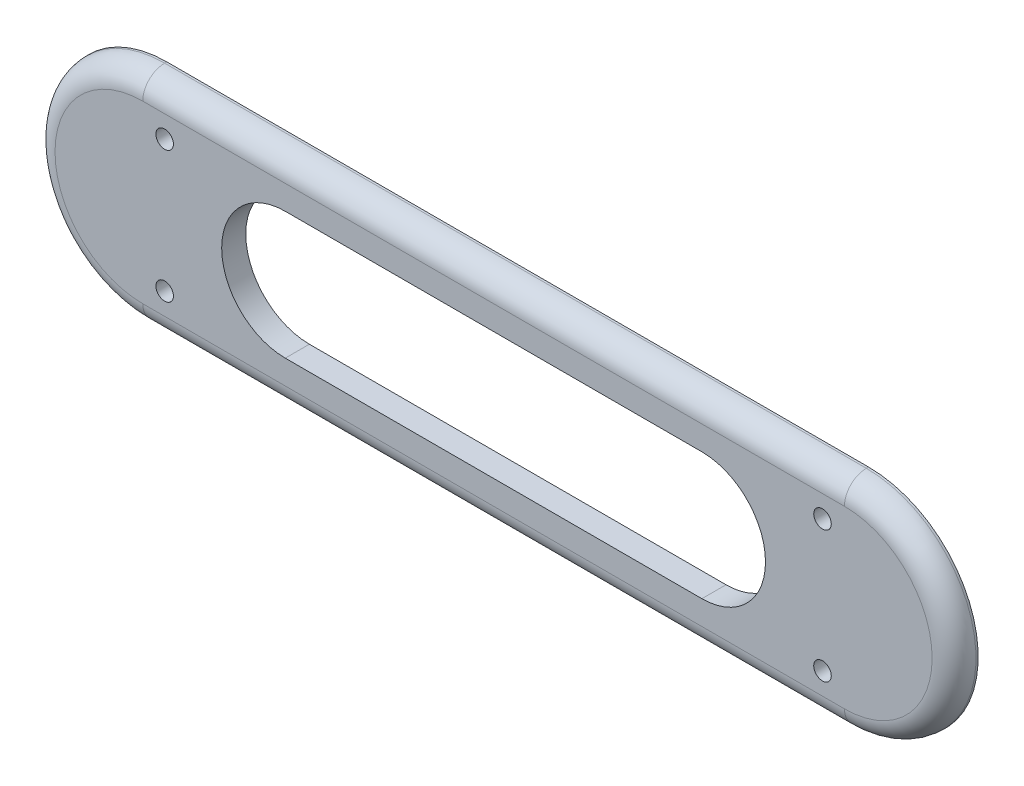
ISO-10303-21;
HEADER;
FILE_DESCRIPTION(('STEP AP214'),'2;1');
FILE_NAME('part.step','',(''),(''),'','','');
FILE_SCHEMA(('AUTOMOTIVE_DESIGN { 1 0 10303 214 1 1 1 1 }'));
ENDSEC;
DATA;
#1=APPLICATION_CONTEXT('core data for automotive mechanical design processes');
#2=APPLICATION_PROTOCOL_DEFINITION('international standard','automotive_design',2000,#1);
#3=PRODUCT_CONTEXT('',#1,'mechanical');
#4=PRODUCT('Part','Part','',(#3));
#5=PRODUCT_RELATED_PRODUCT_CATEGORY('part','',(#4));
#6=PRODUCT_DEFINITION_FORMATION('','',#4);
#7=PRODUCT_DEFINITION_CONTEXT('part definition',#1,'design');
#8=PRODUCT_DEFINITION('design','',#6,#7);
#9=PRODUCT_DEFINITION_SHAPE('','',#8);
#10=(LENGTH_UNIT() NAMED_UNIT(*) SI_UNIT(.MILLI.,.METRE.));
#11=(NAMED_UNIT(*) PLANE_ANGLE_UNIT() SI_UNIT($,.RADIAN.));
#12=(NAMED_UNIT(*) SI_UNIT($,.STERADIAN.) SOLID_ANGLE_UNIT());
#13=UNCERTAINTY_MEASURE_WITH_UNIT(LENGTH_MEASURE(1.E-05),#10,'distance_accuracy_value','');
#14=(GEOMETRIC_REPRESENTATION_CONTEXT(3) GLOBAL_UNCERTAINTY_ASSIGNED_CONTEXT((#13)) GLOBAL_UNIT_ASSIGNED_CONTEXT((#10,
#11,#12)) REPRESENTATION_CONTEXT('',''));
#15=CARTESIAN_POINT('',(0.,0.,0.));
#16=DIRECTION('',(0.,0.,1.));
#17=DIRECTION('',(1.,0.,0.));
#18=AXIS2_PLACEMENT_3D('',#15,#16,#17);
#19=CARTESIAN_POINT('',(-80.,0.,5.5));
#20=DIRECTION('',(0.,0.,-1.));
#21=DIRECTION('',(-1.,0.,0.));
#22=AXIS2_PLACEMENT_3D('',#19,#20,#21);
#23=PLANE('',#22);
#24=DIRECTION('',(1.,0.,0.));
#25=VECTOR('',#24,1.);
#26=CARTESIAN_POINT('',(-80.,-20.,5.5));
#27=LINE('',#26,#25);
#28=CARTESIAN_POINT('',(-80.,-20.,5.5));
#29=VERTEX_POINT('',#28);
#30=CARTESIAN_POINT('',(80.,-20.,5.5));
#31=VERTEX_POINT('',#30);
#32=EDGE_CURVE('E183',#29,#31,#27,.T.);
#33=ORIENTED_EDGE('',*,*,#32,.T.);
#34=CARTESIAN_POINT('',(80.,0.,5.5));
#35=DIRECTION('',(0.,0.,-1.));
#36=DIRECTION('',(-1.,0.,0.));
#37=AXIS2_PLACEMENT_3D('',#34,#35,#36);
#38=CIRCLE('',#37,20.);
#39=CARTESIAN_POINT('',(80.,20.,5.5));
#40=VERTEX_POINT('',#39);
#41=EDGE_CURVE('E190',#31,#40,#38,.F.);
#42=ORIENTED_EDGE('',*,*,#41,.T.);
#43=DIRECTION('',(-1.,0.,0.));
#44=VECTOR('',#43,1.);
#45=CARTESIAN_POINT('',(-80.,20.,5.5));
#46=LINE('',#45,#44);
#47=CARTESIAN_POINT('',(-80.,20.,5.5));
#48=VERTEX_POINT('',#47);
#49=EDGE_CURVE('E182',#40,#48,#46,.T.);
#50=ORIENTED_EDGE('',*,*,#49,.T.);
#51=CARTESIAN_POINT('',(-80.,0.,5.5));
#52=DIRECTION('',(0.,0.,-1.));
#53=DIRECTION('',(-1.,0.,0.));
#54=AXIS2_PLACEMENT_3D('',#51,#52,#53);
#55=CIRCLE('',#54,20.);
#56=EDGE_CURVE('E181',#48,#29,#55,.F.);
#57=ORIENTED_EDGE('',*,*,#56,.T.);
#58=EDGE_LOOP('',(#33,#42,#50,#57));
#59=FACE_BOUND('',#58,.T.);
#60=CARTESIAN_POINT('',(-47.5,0.,5.5));
#61=DIRECTION('',(0.,0.,1.));
#62=DIRECTION('',(1.,0.,0.));
#63=AXIS2_PLACEMENT_3D('',#60,#61,#62);
#64=CIRCLE('',#63,14.5);
#65=CARTESIAN_POINT('',(-47.5,14.5,5.5));
#66=VERTEX_POINT('',#65);
#67=CARTESIAN_POINT('',(-47.5,-14.5,5.5));
#68=VERTEX_POINT('',#67);
#69=EDGE_CURVE('E117',#66,#68,#64,.T.);
#70=ORIENTED_EDGE('',*,*,#69,.F.);
#71=DIRECTION('',(-1.,0.,0.));
#72=VECTOR('',#71,1.);
#73=CARTESIAN_POINT('',(-47.5,14.5,5.5));
#74=LINE('',#73,#72);
#75=CARTESIAN_POINT('',(47.5,14.5,5.5));
#76=VERTEX_POINT('',#75);
#77=EDGE_CURVE('E145',#76,#66,#74,.T.);
#78=ORIENTED_EDGE('',*,*,#77,.F.);
#79=CARTESIAN_POINT('',(47.5,0.,5.5));
#80=DIRECTION('',(0.,0.,1.));
#81=DIRECTION('',(-1.,0.,0.));
#82=AXIS2_PLACEMENT_3D('',#79,#80,#81);
#83=CIRCLE('',#82,14.5);
#84=CARTESIAN_POINT('',(47.5,-14.5,5.5));
#85=VERTEX_POINT('',#84);
#86=EDGE_CURVE('E142',#85,#76,#83,.T.);
#87=ORIENTED_EDGE('',*,*,#86,.F.);
#88=DIRECTION('',(1.,0.,0.));
#89=VECTOR('',#88,1.);
#90=CARTESIAN_POINT('',(-47.5,-14.5,5.5));
#91=LINE('',#90,#89);
#92=EDGE_CURVE('E126',#68,#85,#91,.T.);
#93=ORIENTED_EDGE('',*,*,#92,.F.);
#94=EDGE_LOOP('',(#70,#78,#87,#93));
#95=FACE_BOUND('',#94,.T.);
#96=CARTESIAN_POINT('',(-75.,15.,5.5));
#97=DIRECTION('',(0.,0.,1.));
#98=DIRECTION('',(1.,0.,0.));
#99=AXIS2_PLACEMENT_3D('',#96,#97,#98);
#100=CIRCLE('',#99,2.);
#101=CARTESIAN_POINT('',(-73.,15.,5.5));
#102=VERTEX_POINT('',#101);
#103=EDGE_CURVE('E151',#102,#102,#100,.T.);
#104=ORIENTED_EDGE('',*,*,#103,.F.);
#105=EDGE_LOOP('',(#104));
#106=FACE_BOUND('',#105,.T.);
#107=CARTESIAN_POINT('',(-75.,-15.,5.5));
#108=DIRECTION('',(0.,0.,1.));
#109=DIRECTION('',(-1.,0.,0.));
#110=AXIS2_PLACEMENT_3D('',#107,#108,#109);
#111=CIRCLE('',#110,2.);
#112=CARTESIAN_POINT('',(-77.,-15.,5.5));
#113=VERTEX_POINT('',#112);
#114=EDGE_CURVE('E221',#113,#113,#111,.T.);
#115=ORIENTED_EDGE('',*,*,#114,.F.);
#116=EDGE_LOOP('',(#115));
#117=FACE_BOUND('',#116,.T.);
#118=CARTESIAN_POINT('',(75.,-15.,5.5));
#119=DIRECTION('',(0.,0.,1.));
#120=DIRECTION('',(1.,0.,0.));
#121=AXIS2_PLACEMENT_3D('',#118,#119,#120);
#122=CIRCLE('',#121,2.);
#123=CARTESIAN_POINT('',(77.,-15.,5.5));
#124=VERTEX_POINT('',#123);
#125=EDGE_CURVE('E217',#124,#124,#122,.T.);
#126=ORIENTED_EDGE('',*,*,#125,.F.);
#127=EDGE_LOOP('',(#126));
#128=FACE_BOUND('',#127,.T.);
#129=CARTESIAN_POINT('',(75.,15.,5.5));
#130=DIRECTION('',(0.,0.,1.));
#131=DIRECTION('',(-1.,0.,0.));
#132=AXIS2_PLACEMENT_3D('',#129,#130,#131);
#133=CIRCLE('',#132,2.);
#134=CARTESIAN_POINT('',(73.,15.,5.5));
#135=VERTEX_POINT('',#134);
#136=EDGE_CURVE('E209',#135,#135,#133,.T.);
#137=ORIENTED_EDGE('',*,*,#136,.F.);
#138=EDGE_LOOP('',(#137));
#139=FACE_BOUND('',#138,.T.);
#140=ADVANCED_FACE('F39',(#59,#95,#106,#117,#128,#139),#23,.F.);
#141=CARTESIAN_POINT('',(-80.,0.,0.));
#142=DIRECTION('',(0.,0.,-1.));
#143=DIRECTION('',(-1.,0.,0.));
#144=AXIS2_PLACEMENT_3D('',#141,#142,#143);
#145=PLANE('',#144);
#146=CARTESIAN_POINT('',(75.,-15.,0.));
#147=DIRECTION('',(0.,0.,1.));
#148=DIRECTION('',(1.,0.,0.));
#149=AXIS2_PLACEMENT_3D('',#146,#147,#148);
#150=CIRCLE('',#149,2.);
#151=CARTESIAN_POINT('',(77.,-15.,0.));
#152=VERTEX_POINT('',#151);
#153=EDGE_CURVE('E214',#152,#152,#150,.T.);
#154=ORIENTED_EDGE('',*,*,#153,.T.);
#155=EDGE_LOOP('',(#154));
#156=FACE_BOUND('',#155,.T.);
#157=CARTESIAN_POINT('',(-75.,15.,0.));
#158=DIRECTION('',(0.,0.,1.));
#159=DIRECTION('',(1.,0.,0.));
#160=AXIS2_PLACEMENT_3D('',#157,#158,#159);
#161=CIRCLE('',#160,2.);
#162=CARTESIAN_POINT('',(-73.,15.,0.));
#163=VERTEX_POINT('',#162);
#164=EDGE_CURVE('E230',#163,#163,#161,.T.);
#165=ORIENTED_EDGE('',*,*,#164,.T.);
#166=EDGE_LOOP('',(#165));
#167=FACE_BOUND('',#166,.T.);
#168=CARTESIAN_POINT('',(-80.,0.,0.));
#169=DIRECTION('',(0.,0.,1.));
#170=DIRECTION('',(-1.,0.,0.));
#171=AXIS2_PLACEMENT_3D('',#168,#169,#170);
#172=CIRCLE('',#171,25.);
#173=CARTESIAN_POINT('',(-80.,25.,0.));
#174=VERTEX_POINT('',#173);
#175=CARTESIAN_POINT('',(-80.,-25.,0.));
#176=VERTEX_POINT('',#175);
#177=EDGE_CURVE('E136',#174,#176,#172,.T.);
#178=ORIENTED_EDGE('',*,*,#177,.F.);
#179=DIRECTION('',(-1.,0.,0.));
#180=VECTOR('',#179,1.);
#181=CARTESIAN_POINT('',(-80.,25.,0.));
#182=LINE('',#181,#180);
#183=CARTESIAN_POINT('',(80.,25.,0.));
#184=VERTEX_POINT('',#183);
#185=EDGE_CURVE('E168',#184,#174,#182,.T.);
#186=ORIENTED_EDGE('',*,*,#185,.F.);
#187=CARTESIAN_POINT('',(80.,0.,0.));
#188=DIRECTION('',(0.,0.,1.));
#189=DIRECTION('',(1.,0.,0.));
#190=AXIS2_PLACEMENT_3D('',#187,#188,#189);
#191=CIRCLE('',#190,25.);
#192=CARTESIAN_POINT('',(80.,-25.,0.));
#193=VERTEX_POINT('',#192);
#194=EDGE_CURVE('E170',#193,#184,#191,.T.);
#195=ORIENTED_EDGE('',*,*,#194,.F.);
#196=DIRECTION('',(1.,0.,0.));
#197=VECTOR('',#196,1.);
#198=CARTESIAN_POINT('',(-80.,-25.,0.));
#199=LINE('',#198,#197);
#200=EDGE_CURVE('E163',#176,#193,#199,.T.);
#201=ORIENTED_EDGE('',*,*,#200,.F.);
#202=EDGE_LOOP('',(#178,#186,#195,#201));
#203=FACE_BOUND('',#202,.T.);
#204=DIRECTION('',(-1.,0.,0.));
#205=VECTOR('',#204,1.);
#206=CARTESIAN_POINT('',(-47.5,14.5,0.));
#207=LINE('',#206,#205);
#208=CARTESIAN_POINT('',(47.5,14.5,0.));
#209=VERTEX_POINT('',#208);
#210=CARTESIAN_POINT('',(-47.5,14.5,0.));
#211=VERTEX_POINT('',#210);
#212=EDGE_CURVE('E129',#209,#211,#207,.T.);
#213=ORIENTED_EDGE('',*,*,#212,.T.);
#214=CARTESIAN_POINT('',(-47.5,0.,0.));
#215=DIRECTION('',(0.,0.,1.));
#216=DIRECTION('',(1.,0.,0.));
#217=AXIS2_PLACEMENT_3D('',#214,#215,#216);
#218=CIRCLE('',#217,14.5);
#219=CARTESIAN_POINT('',(-47.5,-14.5,0.));
#220=VERTEX_POINT('',#219);
#221=EDGE_CURVE('E149',#211,#220,#218,.T.);
#222=ORIENTED_EDGE('',*,*,#221,.T.);
#223=DIRECTION('',(1.,0.,0.));
#224=VECTOR('',#223,1.);
#225=CARTESIAN_POINT('',(-47.5,-14.5,0.));
#226=LINE('',#225,#224);
#227=CARTESIAN_POINT('',(47.5,-14.5,0.));
#228=VERTEX_POINT('',#227);
#229=EDGE_CURVE('E134',#220,#228,#226,.T.);
#230=ORIENTED_EDGE('',*,*,#229,.T.);
#231=CARTESIAN_POINT('',(47.5,0.,0.));
#232=DIRECTION('',(0.,0.,1.));
#233=DIRECTION('',(-1.,0.,0.));
#234=AXIS2_PLACEMENT_3D('',#231,#232,#233);
#235=CIRCLE('',#234,14.5);
#236=EDGE_CURVE('E153',#228,#209,#235,.T.);
#237=ORIENTED_EDGE('',*,*,#236,.T.);
#238=EDGE_LOOP('',(#213,#222,#230,#237));
#239=FACE_BOUND('',#238,.T.);
#240=CARTESIAN_POINT('',(-75.,-15.,0.));
#241=DIRECTION('',(0.,0.,1.));
#242=DIRECTION('',(-1.,0.,0.));
#243=AXIS2_PLACEMENT_3D('',#240,#241,#242);
#244=CIRCLE('',#243,2.);
#245=CARTESIAN_POINT('',(-77.,-15.,0.));
#246=VERTEX_POINT('',#245);
#247=EDGE_CURVE('E222',#246,#246,#244,.T.);
#248=ORIENTED_EDGE('',*,*,#247,.T.);
#249=EDGE_LOOP('',(#248));
#250=FACE_BOUND('',#249,.T.);
#251=CARTESIAN_POINT('',(75.,15.,0.));
#252=DIRECTION('',(0.,0.,1.));
#253=DIRECTION('',(-1.,0.,0.));
#254=AXIS2_PLACEMENT_3D('',#251,#252,#253);
#255=CIRCLE('',#254,2.);
#256=CARTESIAN_POINT('',(73.,15.,0.));
#257=VERTEX_POINT('',#256);
#258=EDGE_CURVE('E202',#257,#257,#255,.T.);
#259=ORIENTED_EDGE('',*,*,#258,.T.);
#260=EDGE_LOOP('',(#259));
#261=FACE_BOUND('',#260,.T.);
#262=ADVANCED_FACE('F232',(#156,#167,#203,#239,#250,#261),#145,.T.);
#263=CARTESIAN_POINT('',(-80.,0.,5.5));
#264=DIRECTION('',(0.,0.,-1.));
#265=DIRECTION('',(-1.,0.,0.));
#266=AXIS2_PLACEMENT_3D('',#263,#264,#265);
#267=CYLINDRICAL_SURFACE('',#266,25.);
#268=DIRECTION('',(0.,0.,-1.));
#269=VECTOR('',#268,1.);
#270=CARTESIAN_POINT('',(-80.,-25.,5.5));
#271=LINE('',#270,#269);
#272=CARTESIAN_POINT('',(-80.,-25.,0.5));
#273=VERTEX_POINT('',#272);
#274=EDGE_CURVE('E177',#273,#176,#271,.T.);
#275=ORIENTED_EDGE('',*,*,#274,.F.);
#276=CARTESIAN_POINT('',(-80.,0.,0.5));
#277=DIRECTION('',(0.,0.,-1.));
#278=DIRECTION('',(-1.,0.,0.));
#279=AXIS2_PLACEMENT_3D('',#276,#277,#278);
#280=CIRCLE('',#279,25.);
#281=CARTESIAN_POINT('',(-80.,25.,0.5));
#282=VERTEX_POINT('',#281);
#283=EDGE_CURVE('E48',#273,#282,#280,.T.);
#284=ORIENTED_EDGE('',*,*,#283,.T.);
#285=DIRECTION('',(0.,0.,-1.));
#286=VECTOR('',#285,1.);
#287=CARTESIAN_POINT('',(-80.,25.,5.5));
#288=LINE('',#287,#286);
#289=EDGE_CURVE('E172',#282,#174,#288,.T.);
#290=ORIENTED_EDGE('',*,*,#289,.T.);
#291=ORIENTED_EDGE('',*,*,#177,.T.);
#292=EDGE_LOOP('',(#275,#284,#290,#291));
#293=FACE_BOUND('',#292,.T.);
#294=ADVANCED_FACE('F261',(#293),#267,.T.);
#295=CARTESIAN_POINT('',(-80.,-25.,5.5));
#296=DIRECTION('',(0.,1.,0.));
#297=DIRECTION('',(-1.,0.,0.));
#298=AXIS2_PLACEMENT_3D('',#295,#296,#297);
#299=PLANE('',#298);
#300=DIRECTION('',(0.,0.,-1.));
#301=VECTOR('',#300,1.);
#302=CARTESIAN_POINT('',(80.,-25.,5.5));
#303=LINE('',#302,#301);
#304=CARTESIAN_POINT('',(80.,-25.,0.5));
#305=VERTEX_POINT('',#304);
#306=EDGE_CURVE('E180',#305,#193,#303,.T.);
#307=ORIENTED_EDGE('',*,*,#306,.F.);
#308=DIRECTION('',(1.,0.,0.));
#309=VECTOR('',#308,1.);
#310=CARTESIAN_POINT('',(-80.,-25.,0.5));
#311=LINE('',#310,#309);
#312=EDGE_CURVE('E62',#305,#273,#311,.F.);
#313=ORIENTED_EDGE('',*,*,#312,.T.);
#314=ORIENTED_EDGE('',*,*,#274,.T.);
#315=ORIENTED_EDGE('',*,*,#200,.T.);
#316=EDGE_LOOP('',(#307,#313,#314,#315));
#317=FACE_BOUND('',#316,.T.);
#318=ADVANCED_FACE('F273',(#317),#299,.F.);
#319=CARTESIAN_POINT('',(80.,0.,5.5));
#320=DIRECTION('',(0.,0.,-1.));
#321=DIRECTION('',(-1.,0.,0.));
#322=AXIS2_PLACEMENT_3D('',#319,#320,#321);
#323=CYLINDRICAL_SURFACE('',#322,25.);
#324=DIRECTION('',(0.,0.,-1.));
#325=VECTOR('',#324,1.);
#326=CARTESIAN_POINT('',(80.,25.,5.5));
#327=LINE('',#326,#325);
#328=CARTESIAN_POINT('',(80.,25.,0.5));
#329=VERTEX_POINT('',#328);
#330=EDGE_CURVE('E174',#329,#184,#327,.T.);
#331=ORIENTED_EDGE('',*,*,#330,.F.);
#332=CARTESIAN_POINT('',(80.,0.,0.5));
#333=DIRECTION('',(0.,0.,-1.));
#334=DIRECTION('',(-1.,0.,0.));
#335=AXIS2_PLACEMENT_3D('',#332,#333,#334);
#336=CIRCLE('',#335,25.);
#337=EDGE_CURVE('E189',#329,#305,#336,.T.);
#338=ORIENTED_EDGE('',*,*,#337,.T.);
#339=ORIENTED_EDGE('',*,*,#306,.T.);
#340=ORIENTED_EDGE('',*,*,#194,.T.);
#341=EDGE_LOOP('',(#331,#338,#339,#340));
#342=FACE_BOUND('',#341,.T.);
#343=ADVANCED_FACE('F269',(#342),#323,.T.);
#344=CARTESIAN_POINT('',(-80.,25.,5.5));
#345=DIRECTION('',(0.,-1.,0.));
#346=DIRECTION('',(1.,0.,0.));
#347=AXIS2_PLACEMENT_3D('',#344,#345,#346);
#348=PLANE('',#347);
#349=ORIENTED_EDGE('',*,*,#289,.F.);
#350=DIRECTION('',(-1.,0.,0.));
#351=VECTOR('',#350,1.);
#352=CARTESIAN_POINT('',(-80.,25.,0.5));
#353=LINE('',#352,#351);
#354=EDGE_CURVE('E11',#282,#329,#353,.F.);
#355=ORIENTED_EDGE('',*,*,#354,.T.);
#356=ORIENTED_EDGE('',*,*,#330,.T.);
#357=ORIENTED_EDGE('',*,*,#185,.T.);
#358=EDGE_LOOP('',(#349,#355,#356,#357));
#359=FACE_BOUND('',#358,.T.);
#360=ADVANCED_FACE('F270',(#359),#348,.F.);
#361=CARTESIAN_POINT('',(-47.5,0.,5.5));
#362=DIRECTION('',(0.,0.,-1.));
#363=DIRECTION('',(-1.,0.,0.));
#364=AXIS2_PLACEMENT_3D('',#361,#362,#363);
#365=CYLINDRICAL_SURFACE('',#364,14.5);
#366=ORIENTED_EDGE('',*,*,#221,.F.);
#367=DIRECTION('',(0.,0.,-1.));
#368=VECTOR('',#367,1.);
#369=CARTESIAN_POINT('',(-47.5,14.5,5.5));
#370=LINE('',#369,#368);
#371=EDGE_CURVE('E122',#66,#211,#370,.T.);
#372=ORIENTED_EDGE('',*,*,#371,.F.);
#373=ORIENTED_EDGE('',*,*,#69,.T.);
#374=DIRECTION('',(0.,0.,-1.));
#375=VECTOR('',#374,1.);
#376=CARTESIAN_POINT('',(-47.5,-14.5,5.5));
#377=LINE('',#376,#375);
#378=EDGE_CURVE('E121',#68,#220,#377,.T.);
#379=ORIENTED_EDGE('',*,*,#378,.T.);
#380=EDGE_LOOP('',(#366,#372,#373,#379));
#381=FACE_BOUND('',#380,.T.);
#382=ADVANCED_FACE('F119',(#381),#365,.F.);
#383=CARTESIAN_POINT('',(-47.5,-14.5,5.5));
#384=DIRECTION('',(0.,1.,0.));
#385=DIRECTION('',(-1.,0.,0.));
#386=AXIS2_PLACEMENT_3D('',#383,#384,#385);
#387=PLANE('',#386);
#388=ORIENTED_EDGE('',*,*,#229,.F.);
#389=ORIENTED_EDGE('',*,*,#378,.F.);
#390=ORIENTED_EDGE('',*,*,#92,.T.);
#391=DIRECTION('',(0.,0.,-1.));
#392=VECTOR('',#391,1.);
#393=CARTESIAN_POINT('',(47.5,-14.5,5.5));
#394=LINE('',#393,#392);
#395=EDGE_CURVE('E140',#85,#228,#394,.T.);
#396=ORIENTED_EDGE('',*,*,#395,.T.);
#397=EDGE_LOOP('',(#388,#389,#390,#396));
#398=FACE_BOUND('',#397,.T.);
#399=ADVANCED_FACE('F135',(#398),#387,.T.);
#400=CARTESIAN_POINT('',(47.5,0.,5.5));
#401=DIRECTION('',(0.,0.,-1.));
#402=DIRECTION('',(-1.,0.,0.));
#403=AXIS2_PLACEMENT_3D('',#400,#401,#402);
#404=CYLINDRICAL_SURFACE('',#403,14.5);
#405=ORIENTED_EDGE('',*,*,#236,.F.);
#406=ORIENTED_EDGE('',*,*,#395,.F.);
#407=ORIENTED_EDGE('',*,*,#86,.T.);
#408=DIRECTION('',(0.,0.,-1.));
#409=VECTOR('',#408,1.);
#410=CARTESIAN_POINT('',(47.5,14.5,5.5));
#411=LINE('',#410,#409);
#412=EDGE_CURVE('E157',#76,#209,#411,.T.);
#413=ORIENTED_EDGE('',*,*,#412,.T.);
#414=EDGE_LOOP('',(#405,#406,#407,#413));
#415=FACE_BOUND('',#414,.T.);
#416=ADVANCED_FACE('F249',(#415),#404,.F.);
#417=CARTESIAN_POINT('',(-47.5,14.5,5.5));
#418=DIRECTION('',(0.,-1.,0.));
#419=DIRECTION('',(1.,0.,0.));
#420=AXIS2_PLACEMENT_3D('',#417,#418,#419);
#421=PLANE('',#420);
#422=ORIENTED_EDGE('',*,*,#212,.F.);
#423=ORIENTED_EDGE('',*,*,#412,.F.);
#424=ORIENTED_EDGE('',*,*,#77,.T.);
#425=ORIENTED_EDGE('',*,*,#371,.T.);
#426=EDGE_LOOP('',(#422,#423,#424,#425));
#427=FACE_BOUND('',#426,.T.);
#428=ADVANCED_FACE('F238',(#427),#421,.T.);
#429=CARTESIAN_POINT('',(-75.,15.,5.5));
#430=DIRECTION('',(0.,0.,-1.));
#431=DIRECTION('',(-1.,0.,0.));
#432=AXIS2_PLACEMENT_3D('',#429,#430,#431);
#433=CYLINDRICAL_SURFACE('',#432,2.);
#434=ORIENTED_EDGE('',*,*,#103,.T.);
#435=EDGE_LOOP('',(#434));
#436=FACE_BOUND('',#435,.T.);
#437=ORIENTED_EDGE('',*,*,#164,.F.);
#438=EDGE_LOOP('',(#437));
#439=FACE_BOUND('',#438,.T.);
#440=ADVANCED_FACE('F240',(#436,#439),#433,.F.);
#441=CARTESIAN_POINT('',(-75.,-15.,5.5));
#442=DIRECTION('',(0.,0.,-1.));
#443=DIRECTION('',(-1.,0.,0.));
#444=AXIS2_PLACEMENT_3D('',#441,#442,#443);
#445=CYLINDRICAL_SURFACE('',#444,2.);
#446=ORIENTED_EDGE('',*,*,#114,.T.);
#447=EDGE_LOOP('',(#446));
#448=FACE_BOUND('',#447,.T.);
#449=ORIENTED_EDGE('',*,*,#247,.F.);
#450=EDGE_LOOP('',(#449));
#451=FACE_BOUND('',#450,.T.);
#452=ADVANCED_FACE('F239',(#448,#451),#445,.F.);
#453=CARTESIAN_POINT('',(75.,-15.,5.5));
#454=DIRECTION('',(0.,0.,-1.));
#455=DIRECTION('',(-1.,0.,0.));
#456=AXIS2_PLACEMENT_3D('',#453,#454,#455);
#457=CYLINDRICAL_SURFACE('',#456,2.);
#458=ORIENTED_EDGE('',*,*,#125,.T.);
#459=EDGE_LOOP('',(#458));
#460=FACE_BOUND('',#459,.T.);
#461=ORIENTED_EDGE('',*,*,#153,.F.);
#462=EDGE_LOOP('',(#461));
#463=FACE_BOUND('',#462,.T.);
#464=ADVANCED_FACE('F250',(#460,#463),#457,.F.);
#465=CARTESIAN_POINT('',(75.,15.,5.5));
#466=DIRECTION('',(0.,0.,-1.));
#467=DIRECTION('',(-1.,0.,0.));
#468=AXIS2_PLACEMENT_3D('',#465,#466,#467);
#469=CYLINDRICAL_SURFACE('',#468,2.);
#470=ORIENTED_EDGE('',*,*,#136,.T.);
#471=EDGE_LOOP('',(#470));
#472=FACE_BOUND('',#471,.T.);
#473=ORIENTED_EDGE('',*,*,#258,.F.);
#474=EDGE_LOOP('',(#473));
#475=FACE_BOUND('',#474,.T.);
#476=ADVANCED_FACE('F289',(#472,#475),#469,.F.);
#477=CARTESIAN_POINT('',(-80.,0.,0.5));
#478=DIRECTION('',(0.,0.,-1.));
#479=DIRECTION('',(-1.,0.,0.));
#480=AXIS2_PLACEMENT_3D('',#477,#478,#479);
#481=TOROIDAL_SURFACE('',#480,20.,5.);
#482=CARTESIAN_POINT('',(-80.,20.,0.5));
#483=DIRECTION('',(1.,0.,0.));
#484=DIRECTION('',(0.,0.,-1.));
#485=AXIS2_PLACEMENT_3D('',#482,#483,#484);
#486=CIRCLE('',#485,5.);
#487=EDGE_CURVE('E196',#282,#48,#486,.T.);
#488=ORIENTED_EDGE('',*,*,#487,.F.);
#489=ORIENTED_EDGE('',*,*,#283,.F.);
#490=CARTESIAN_POINT('',(-80.,-20.,0.5));
#491=DIRECTION('',(1.,0.,0.));
#492=DIRECTION('',(0.,0.,-1.));
#493=AXIS2_PLACEMENT_3D('',#490,#491,#492);
#494=CIRCLE('',#493,5.);
#495=EDGE_CURVE('E43',#29,#273,#494,.T.);
#496=ORIENTED_EDGE('',*,*,#495,.F.);
#497=ORIENTED_EDGE('',*,*,#56,.F.);
#498=EDGE_LOOP('',(#488,#489,#496,#497));
#499=FACE_BOUND('',#498,.T.);
#500=ADVANCED_FACE('F41',(#499),#481,.T.);
#501=CARTESIAN_POINT('',(-80.,-20.,0.5));
#502=DIRECTION('',(1.,0.,0.));
#503=DIRECTION('',(0.,1.,0.));
#504=AXIS2_PLACEMENT_3D('',#501,#502,#503);
#505=CYLINDRICAL_SURFACE('',#504,5.);
#506=ORIENTED_EDGE('',*,*,#495,.T.);
#507=ORIENTED_EDGE('',*,*,#312,.F.);
#508=CARTESIAN_POINT('',(80.,-20.,0.5));
#509=DIRECTION('',(1.,0.,0.));
#510=DIRECTION('',(0.,0.,-1.));
#511=AXIS2_PLACEMENT_3D('',#508,#509,#510);
#512=CIRCLE('',#511,5.);
#513=EDGE_CURVE('E197',#31,#305,#512,.T.);
#514=ORIENTED_EDGE('',*,*,#513,.F.);
#515=ORIENTED_EDGE('',*,*,#32,.F.);
#516=EDGE_LOOP('',(#506,#507,#514,#515));
#517=FACE_BOUND('',#516,.T.);
#518=ADVANCED_FACE('F284',(#517),#505,.T.);
#519=CARTESIAN_POINT('',(-80.,20.,0.5));
#520=DIRECTION('',(-1.,0.,0.));
#521=DIRECTION('',(0.,-1.,0.));
#522=AXIS2_PLACEMENT_3D('',#519,#520,#521);
#523=CYLINDRICAL_SURFACE('',#522,5.);
#524=ORIENTED_EDGE('',*,*,#487,.T.);
#525=ORIENTED_EDGE('',*,*,#49,.F.);
#526=CARTESIAN_POINT('',(80.,20.,0.5));
#527=DIRECTION('',(1.,0.,0.));
#528=DIRECTION('',(0.,0.,-1.));
#529=AXIS2_PLACEMENT_3D('',#526,#527,#528);
#530=CIRCLE('',#529,5.);
#531=EDGE_CURVE('E194',#329,#40,#530,.T.);
#532=ORIENTED_EDGE('',*,*,#531,.F.);
#533=ORIENTED_EDGE('',*,*,#354,.F.);
#534=EDGE_LOOP('',(#524,#525,#532,#533));
#535=FACE_BOUND('',#534,.T.);
#536=ADVANCED_FACE('F285',(#535),#523,.T.);
#537=CARTESIAN_POINT('',(80.,0.,0.5));
#538=DIRECTION('',(0.,0.,-1.));
#539=DIRECTION('',(-1.,0.,0.));
#540=AXIS2_PLACEMENT_3D('',#537,#538,#539);
#541=TOROIDAL_SURFACE('',#540,20.,5.);
#542=ORIENTED_EDGE('',*,*,#513,.T.);
#543=ORIENTED_EDGE('',*,*,#337,.F.);
#544=ORIENTED_EDGE('',*,*,#531,.T.);
#545=ORIENTED_EDGE('',*,*,#41,.F.);
#546=EDGE_LOOP('',(#542,#543,#544,#545));
#547=FACE_BOUND('',#546,.T.);
#548=ADVANCED_FACE('F276',(#547),#541,.T.);
#549=CLOSED_SHELL('',(#140,#262,#294,#318,#343,#360,#382,#399,#416,#428,#440,#452,#464,#476,
#500,#518,#536,#548));
#550=MANIFOLD_SOLID_BREP('B2',#549);
#551=ADVANCED_BREP_SHAPE_REPRESENTATION('',(#18,#550),#14);
#552=SHAPE_DEFINITION_REPRESENTATION(#9,#551);
ENDSEC;
END-ISO-10303-21;
